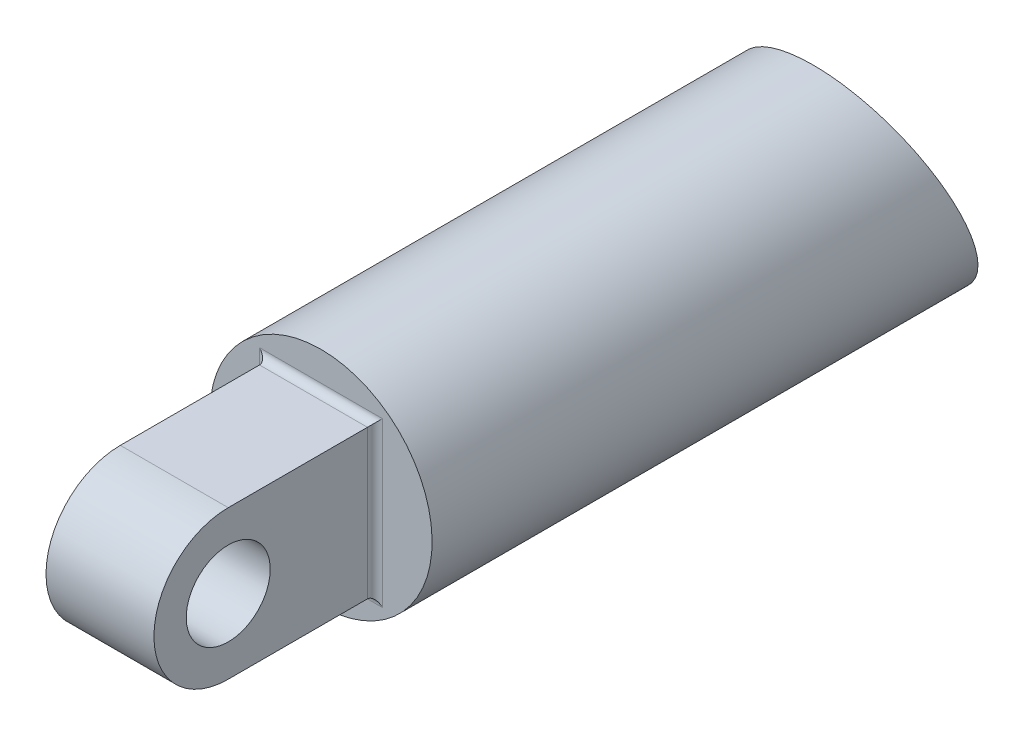
ISO-10303-21;
HEADER;
FILE_DESCRIPTION(('STEP AP214'),'2;1');
FILE_NAME('part.step','',(''),(''),'','','');
FILE_SCHEMA(('AUTOMOTIVE_DESIGN { 1 0 10303 214 1 1 1 1 }'));
ENDSEC;
DATA;
#1=APPLICATION_CONTEXT('core data for automotive mechanical design processes');
#2=APPLICATION_PROTOCOL_DEFINITION('international standard','automotive_design',2000,#1);
#3=PRODUCT_CONTEXT('',#1,'mechanical');
#4=PRODUCT('Part','Part','',(#3));
#5=PRODUCT_RELATED_PRODUCT_CATEGORY('part','',(#4));
#6=PRODUCT_DEFINITION_FORMATION('','',#4);
#7=PRODUCT_DEFINITION_CONTEXT('part definition',#1,'design');
#8=PRODUCT_DEFINITION('design','',#6,#7);
#9=PRODUCT_DEFINITION_SHAPE('','',#8);
#10=(LENGTH_UNIT() NAMED_UNIT(*) SI_UNIT(.MILLI.,.METRE.));
#11=(NAMED_UNIT(*) PLANE_ANGLE_UNIT() SI_UNIT($,.RADIAN.));
#12=(NAMED_UNIT(*) SI_UNIT($,.STERADIAN.) SOLID_ANGLE_UNIT());
#13=UNCERTAINTY_MEASURE_WITH_UNIT(LENGTH_MEASURE(1.E-05),#10,'distance_accuracy_value','');
#14=(GEOMETRIC_REPRESENTATION_CONTEXT(3) GLOBAL_UNCERTAINTY_ASSIGNED_CONTEXT((#13)) GLOBAL_UNIT_ASSIGNED_CONTEXT((#10,
#11,#12)) REPRESENTATION_CONTEXT('',''));
#15=CARTESIAN_POINT('',(0.,0.,0.));
#16=DIRECTION('',(0.,0.,1.));
#17=DIRECTION('',(1.,0.,0.));
#18=AXIS2_PLACEMENT_3D('',#15,#16,#17);
#19=CARTESIAN_POINT('',(-22.8599999999998,-3.60822483003176E-13,172.487053046245));
#20=DIRECTION('',(1.,0.,0.));
#21=DIRECTION('',(0.,1.,0.));
#22=AXIS2_PLACEMENT_3D('',#19,#20,#21);
#23=CYLINDRICAL_SURFACE('',#22,17.78);
#24=CARTESIAN_POINT('',(-22.8599999999997,-3.60822483003176E-13,172.487053046245));
#25=DIRECTION('',(1.,0.,0.));
#26=DIRECTION('',(0.,1.,0.));
#27=AXIS2_PLACEMENT_3D('',#24,#25,#26);
#28=CIRCLE('',#27,17.78);
#29=CARTESIAN_POINT('',(-22.8599999999997,17.7799999999996,172.487053046245));
#30=VERTEX_POINT('',#29);
#31=EDGE_CURVE('E108',#30,#30,#28,.F.);
#32=ORIENTED_EDGE('',*,*,#31,.T.);
#33=EDGE_LOOP('',(#32));
#34=FACE_BOUND('',#33,.T.);
#35=CARTESIAN_POINT('',(22.86,-3.29597460435593E-13,172.487053046245));
#36=DIRECTION('',(1.,0.,0.));
#37=DIRECTION('',(0.,1.,0.));
#38=AXIS2_PLACEMENT_3D('',#35,#36,#37);
#39=CIRCLE('',#38,17.78);
#40=CARTESIAN_POINT('',(22.86,17.7799999999997,172.487053046245));
#41=VERTEX_POINT('',#40);
#42=EDGE_CURVE('E74',#41,#41,#39,.F.);
#43=ORIENTED_EDGE('',*,*,#42,.F.);
#44=EDGE_LOOP('',(#43));
#45=FACE_BOUND('',#44,.T.);
#46=ADVANCED_FACE('F17',(#34,#45),#23,.F.);
#47=CARTESIAN_POINT('',(-22.8599999999998,-5.41433564649196E-13,172.487053046245));
#48=DIRECTION('',(1.,0.,0.));
#49=DIRECTION('',(0.,0.,-1.));
#50=AXIS2_PLACEMENT_3D('',#47,#48,#49);
#51=CYLINDRICAL_SURFACE('',#50,31.473842866138);
#52=CARTESIAN_POINT('',(-22.8599999999997,-5.41433564649196E-13,172.487053046245));
#53=DIRECTION('',(1.,0.,0.));
#54=DIRECTION('',(0.,0.,-1.));
#55=AXIS2_PLACEMENT_3D('',#52,#53,#54);
#56=CIRCLE('',#55,31.473842866138);
#57=CARTESIAN_POINT('',(-22.8599999999998,31.4738428661375,172.487053046245));
#58=VERTEX_POINT('',#57);
#59=CARTESIAN_POINT('',(-22.8599999999997,-31.4738428661386,172.487053046245));
#60=VERTEX_POINT('',#59);
#61=EDGE_CURVE('E112',#58,#60,#56,.T.);
#62=ORIENTED_EDGE('',*,*,#61,.T.);
#63=DIRECTION('',(1.,0.,0.));
#64=VECTOR('',#63,1.);
#65=CARTESIAN_POINT('',(-22.8599999999997,-31.4738428661386,172.487053046245));
#66=LINE('',#65,#64);
#67=CARTESIAN_POINT('',(22.86,-31.4738428661385,172.487053046245));
#68=VERTEX_POINT('',#67);
#69=EDGE_CURVE('E70',#68,#60,#66,.F.);
#70=ORIENTED_EDGE('',*,*,#69,.F.);
#71=CARTESIAN_POINT('',(22.8599999999999,-5.10977926637679E-13,172.487053046245));
#72=DIRECTION('',(1.,0.,0.));
#73=DIRECTION('',(0.,0.,-1.));
#74=AXIS2_PLACEMENT_3D('',#71,#72,#73);
#75=CIRCLE('',#74,31.473842866138);
#76=CARTESIAN_POINT('',(22.8599999999999,31.4738428661375,172.487053046245));
#77=VERTEX_POINT('',#76);
#78=EDGE_CURVE('E20',#77,#68,#75,.T.);
#79=ORIENTED_EDGE('',*,*,#78,.F.);
#80=DIRECTION('',(1.,0.,0.));
#81=VECTOR('',#80,1.);
#82=CARTESIAN_POINT('',(-22.8599999999997,31.4738428661375,172.487053046245));
#83=LINE('',#82,#81);
#84=EDGE_CURVE('E67',#58,#77,#83,.T.);
#85=ORIENTED_EDGE('',*,*,#84,.F.);
#86=EDGE_LOOP('',(#62,#70,#79,#85));
#87=FACE_BOUND('',#86,.T.);
#88=ADVANCED_FACE('F65',(#87),#51,.T.);
#89=CARTESIAN_POINT('',(22.8599999999999,-5.41433564649196E-13,151.55978917756));
#90=DIRECTION('',(1.,0.,0.));
#91=DIRECTION('',(0.,1.,0.));
#92=AXIS2_PLACEMENT_3D('',#89,#90,#91);
#93=PLANE('',#92);
#94=ORIENTED_EDGE('',*,*,#42,.T.);
#95=EDGE_LOOP('',(#94));
#96=FACE_BOUND('',#95,.T.);
#97=ORIENTED_EDGE('',*,*,#78,.T.);
#98=DIRECTION('',(0.,0.,1.));
#99=VECTOR('',#98,1.);
#100=CARTESIAN_POINT('',(22.8600000000001,-31.4738428661385,110.342111586706));
#101=LINE('',#100,#99);
#102=CARTESIAN_POINT('',(22.86,-31.4738428661385,113.517111586706));
#103=VERTEX_POINT('',#102);
#104=EDGE_CURVE('E111',#103,#68,#101,.T.);
#105=ORIENTED_EDGE('',*,*,#104,.F.);
#106=DIRECTION('',(0.,-1.,0.));
#107=VECTOR('',#106,1.);
#108=CARTESIAN_POINT('',(22.8599999999999,-5.43560634080617E-13,113.517111586706));
#109=LINE('',#108,#107);
#110=CARTESIAN_POINT('',(22.8599999999999,31.4738428661375,113.517111586706));
#111=VERTEX_POINT('',#110);
#112=EDGE_CURVE('E79',#111,#103,#109,.T.);
#113=ORIENTED_EDGE('',*,*,#112,.F.);
#114=DIRECTION('',(0.,0.,1.));
#115=VECTOR('',#114,1.);
#116=CARTESIAN_POINT('',(22.86,31.4738428661375,172.487053046245));
#117=LINE('',#116,#115);
#118=EDGE_CURVE('E76',#77,#111,#117,.F.);
#119=ORIENTED_EDGE('',*,*,#118,.F.);
#120=EDGE_LOOP('',(#97,#105,#113,#119));
#121=FACE_BOUND('',#120,.T.);
#122=ADVANCED_FACE('F77',(#96,#121),#93,.T.);
#123=CARTESIAN_POINT('',(-22.8599999999997,31.4738428661375,172.487053046245));
#124=DIRECTION('',(0.,1.,0.));
#125=DIRECTION('',(0.,0.,1.));
#126=AXIS2_PLACEMENT_3D('',#123,#124,#125);
#127=PLANE('',#126);
#128=ORIENTED_EDGE('',*,*,#84,.T.);
#129=ORIENTED_EDGE('',*,*,#118,.T.);
#130=DIRECTION('',(1.,0.,0.));
#131=VECTOR('',#130,1.);
#132=CARTESIAN_POINT('',(-11.4299999999998,31.4738428661375,113.517111586706));
#133=LINE('',#132,#131);
#134=CARTESIAN_POINT('',(-22.8599999999998,31.4738428661375,113.517111586706));
#135=VERTEX_POINT('',#134);
#136=EDGE_CURVE('E107',#135,#111,#133,.T.);
#137=ORIENTED_EDGE('',*,*,#136,.F.);
#138=DIRECTION('',(0.,0.,1.));
#139=VECTOR('',#138,1.);
#140=CARTESIAN_POINT('',(-22.8599999999998,31.4738428661375,151.55978917756));
#141=LINE('',#140,#139);
#142=EDGE_CURVE('E82',#135,#58,#141,.T.);
#143=ORIENTED_EDGE('',*,*,#142,.T.);
#144=EDGE_LOOP('',(#128,#129,#137,#143));
#145=FACE_BOUND('',#144,.T.);
#146=ADVANCED_FACE('F84',(#145),#127,.T.);
#147=CARTESIAN_POINT('',(-22.8599999999999,-5.41433564649196E-13,151.55978917756));
#148=DIRECTION('',(1.,0.,0.));
#149=DIRECTION('',(0.,1.,0.));
#150=AXIS2_PLACEMENT_3D('',#147,#148,#149);
#151=PLANE('',#150);
#152=ORIENTED_EDGE('',*,*,#31,.F.);
#153=EDGE_LOOP('',(#152));
#154=FACE_BOUND('',#153,.T.);
#155=DIRECTION('',(0.,0.,1.));
#156=VECTOR('',#155,1.);
#157=CARTESIAN_POINT('',(-22.8599999999997,-31.4738428661385,110.342111586706));
#158=LINE('',#157,#156);
#159=CARTESIAN_POINT('',(-22.8599999999998,-31.4738428661386,113.517111586706));
#160=VERTEX_POINT('',#159);
#161=EDGE_CURVE('E120',#60,#160,#158,.F.);
#162=ORIENTED_EDGE('',*,*,#161,.F.);
#163=ORIENTED_EDGE('',*,*,#61,.F.);
#164=ORIENTED_EDGE('',*,*,#142,.F.);
#165=DIRECTION('',(0.,1.,0.));
#166=VECTOR('',#165,1.);
#167=CARTESIAN_POINT('',(-22.8599999999999,-5.44946428182872E-13,113.517111586706));
#168=LINE('',#167,#166);
#169=EDGE_CURVE('E103',#160,#135,#168,.T.);
#170=ORIENTED_EDGE('',*,*,#169,.F.);
#171=EDGE_LOOP('',(#162,#163,#164,#170));
#172=FACE_BOUND('',#171,.T.);
#173=ADVANCED_FACE('F148',(#154,#172),#151,.F.);
#174=CARTESIAN_POINT('',(-22.8599999999997,-31.4738428661385,110.342111586706));
#175=DIRECTION('',(0.,-1.,0.));
#176=DIRECTION('',(1.,0.,0.));
#177=AXIS2_PLACEMENT_3D('',#174,#175,#176);
#178=PLANE('',#177);
#179=ORIENTED_EDGE('',*,*,#69,.T.);
#180=ORIENTED_EDGE('',*,*,#161,.T.);
#181=DIRECTION('',(-1.,0.,0.));
#182=VECTOR('',#181,1.);
#183=CARTESIAN_POINT('',(-11.4299999999998,-31.4738428661386,113.517111586706));
#184=LINE('',#183,#182);
#185=EDGE_CURVE('E100',#103,#160,#184,.T.);
#186=ORIENTED_EDGE('',*,*,#185,.F.);
#187=ORIENTED_EDGE('',*,*,#104,.T.);
#188=EDGE_LOOP('',(#179,#180,#186,#187));
#189=FACE_BOUND('',#188,.T.);
#190=ADVANCED_FACE('F151',(#189),#178,.T.);
#191=CARTESIAN_POINT('',(26.0349999999999,35.0646289805311,113.517111586706));
#192=DIRECTION('',(0.,-1.,0.));
#193=DIRECTION('',(1.,0.,0.));
#194=AXIS2_PLACEMENT_3D('',#191,#192,#193);
#195=CYLINDRICAL_SURFACE('',#194,3.175);
#196=CARTESIAN_POINT('',(26.0349999999999,-34.6488428661385,113.517111586706));
#197=DIRECTION('',(-0.707106781186547,-0.707106781186548,0.));
#198=DIRECTION('',(-0.707106781186548,0.707106781186547,0.));
#199=AXIS2_PLACEMENT_3D('',#196,#197,#198);
#200=ELLIPSE('',#199,4.49012806053458,3.175);
#201=CARTESIAN_POINT('',(26.0349999999999,-34.6488428661385,110.342111586706));
#202=VERTEX_POINT('',#201);
#203=EDGE_CURVE('E94',#202,#103,#200,.F.);
#204=ORIENTED_EDGE('',*,*,#203,.F.);
#205=DIRECTION('',(0.,1.,0.));
#206=VECTOR('',#205,1.);
#207=CARTESIAN_POINT('',(26.0349999999999,-5.41433564649196E-13,110.342111586706));
#208=LINE('',#207,#206);
#209=CARTESIAN_POINT('',(26.0349999999998,34.6488428661375,110.342111586706));
#210=VERTEX_POINT('',#209);
#211=EDGE_CURVE('E97',#202,#210,#208,.T.);
#212=ORIENTED_EDGE('',*,*,#211,.T.);
#213=CARTESIAN_POINT('',(26.0349999999999,34.6488428661375,113.517111586706));
#214=DIRECTION('',(0.707106781186548,-0.707106781186547,0.));
#215=DIRECTION('',(0.707106781186547,0.707106781186548,0.));
#216=AXIS2_PLACEMENT_3D('',#213,#214,#215);
#217=ELLIPSE('',#216,4.49012806053458,3.175);
#218=EDGE_CURVE('E104',#111,#210,#217,.T.);
#219=ORIENTED_EDGE('',*,*,#218,.F.);
#220=ORIENTED_EDGE('',*,*,#112,.T.);
#221=EDGE_LOOP('',(#204,#212,#219,#220));
#222=FACE_BOUND('',#221,.T.);
#223=ADVANCED_FACE('F142',(#222),#195,.F.);
#224=CARTESIAN_POINT('',(-26.3474199999998,34.6488428661374,113.517111586706));
#225=DIRECTION('',(1.,0.,0.));
#226=DIRECTION('',(0.,1.,0.));
#227=AXIS2_PLACEMENT_3D('',#224,#225,#226);
#228=CYLINDRICAL_SURFACE('',#227,3.175);
#229=ORIENTED_EDGE('',*,*,#218,.T.);
#230=DIRECTION('',(1.,0.,0.));
#231=VECTOR('',#230,1.);
#232=CARTESIAN_POINT('',(0.,34.6488428661375,110.342111586706));
#233=LINE('',#232,#231);
#234=CARTESIAN_POINT('',(-26.0349999999998,34.6488428661374,110.342111586706));
#235=VERTEX_POINT('',#234);
#236=EDGE_CURVE('E116',#210,#235,#233,.F.);
#237=ORIENTED_EDGE('',*,*,#236,.T.);
#238=CARTESIAN_POINT('',(-26.0349999999998,34.6488428661374,113.517111586706));
#239=DIRECTION('',(0.707106781186548,0.707106781186547,0.));
#240=DIRECTION('',(-0.707106781186547,0.707106781186548,0.));
#241=AXIS2_PLACEMENT_3D('',#238,#239,#240);
#242=ELLIPSE('',#241,4.49012806053457,3.175);
#243=EDGE_CURVE('E101',#135,#235,#242,.T.);
#244=ORIENTED_EDGE('',*,*,#243,.F.);
#245=ORIENTED_EDGE('',*,*,#136,.T.);
#246=EDGE_LOOP('',(#229,#237,#244,#245));
#247=FACE_BOUND('',#246,.T.);
#248=ADVANCED_FACE('F144',(#247),#228,.F.);
#249=CARTESIAN_POINT('',(-26.0349999999999,-35.0646289805322,113.517111586706));
#250=DIRECTION('',(0.,1.,0.));
#251=DIRECTION('',(0.,0.,1.));
#252=AXIS2_PLACEMENT_3D('',#249,#250,#251);
#253=CYLINDRICAL_SURFACE('',#252,3.175);
#254=ORIENTED_EDGE('',*,*,#243,.T.);
#255=DIRECTION('',(0.,1.,0.));
#256=VECTOR('',#255,1.);
#257=CARTESIAN_POINT('',(-26.0349999999998,-5.41433564649196E-13,110.342111586706));
#258=LINE('',#257,#256);
#259=CARTESIAN_POINT('',(-26.0349999999999,-34.6488428661385,110.342111586706));
#260=VERTEX_POINT('',#259);
#261=EDGE_CURVE('E35',#235,#260,#258,.F.);
#262=ORIENTED_EDGE('',*,*,#261,.T.);
#263=CARTESIAN_POINT('',(-26.0349999999999,-34.6488428661386,113.517111586706));
#264=DIRECTION('',(-0.707106781186547,0.707106781186548,0.));
#265=DIRECTION('',(-0.707106781186548,-0.707106781186547,0.));
#266=AXIS2_PLACEMENT_3D('',#263,#264,#265);
#267=ELLIPSE('',#266,4.49012806053458,3.175);
#268=EDGE_CURVE('E98',#160,#260,#267,.T.);
#269=ORIENTED_EDGE('',*,*,#268,.F.);
#270=ORIENTED_EDGE('',*,*,#169,.T.);
#271=EDGE_LOOP('',(#254,#262,#269,#270));
#272=FACE_BOUND('',#271,.T.);
#273=ADVANCED_FACE('F179',(#272),#253,.F.);
#274=CARTESIAN_POINT('',(26.3474199999999,-34.6488428661385,113.517111586706));
#275=DIRECTION('',(-1.,0.,0.));
#276=DIRECTION('',(0.,-1.,0.));
#277=AXIS2_PLACEMENT_3D('',#274,#275,#276);
#278=CYLINDRICAL_SURFACE('',#277,3.175);
#279=DIRECTION('',(1.,0.,0.));
#280=VECTOR('',#279,1.);
#281=CARTESIAN_POINT('',(0.,-34.6488428661386,110.342111586706));
#282=LINE('',#281,#280);
#283=EDGE_CURVE('E93',#260,#202,#282,.T.);
#284=ORIENTED_EDGE('',*,*,#283,.T.);
#285=ORIENTED_EDGE('',*,*,#203,.T.);
#286=ORIENTED_EDGE('',*,*,#185,.T.);
#287=ORIENTED_EDGE('',*,*,#268,.T.);
#288=EDGE_LOOP('',(#284,#285,#286,#287));
#289=FACE_BOUND('',#288,.T.);
#290=ADVANCED_FACE('F135',(#289),#278,.F.);
#291=CARTESIAN_POINT('',(0.,-5.41433564649196E-13,110.342111586706));
#292=DIRECTION('',(0.,0.,-1.));
#293=DIRECTION('',(0.,1.,0.));
#294=AXIS2_PLACEMENT_3D('',#291,#292,#293);
#295=PLANE('',#294);
#296=CARTESIAN_POINT('',(0.,-5.41433564649196E-13,110.342111586706));
#297=DIRECTION('',(0.,0.,-1.));
#298=DIRECTION('',(0.,1.,0.));
#299=AXIS2_PLACEMENT_3D('',#296,#297,#298);
#300=CIRCLE('',#299,47.0758077535598);
#301=CARTESIAN_POINT('',(0.,47.0758077535592,110.342111586706));
#302=VERTEX_POINT('',#301);
#303=EDGE_CURVE('E26',#302,#302,#300,.T.);
#304=ORIENTED_EDGE('',*,*,#303,.F.);
#305=EDGE_LOOP('',(#304));
#306=FACE_BOUND('',#305,.T.);
#307=ORIENTED_EDGE('',*,*,#261,.F.);
#308=ORIENTED_EDGE('',*,*,#236,.F.);
#309=ORIENTED_EDGE('',*,*,#211,.F.);
#310=ORIENTED_EDGE('',*,*,#283,.F.);
#311=EDGE_LOOP('',(#307,#308,#309,#310));
#312=FACE_BOUND('',#311,.T.);
#313=ADVANCED_FACE('F140',(#306,#312),#295,.F.);
#314=CARTESIAN_POINT('',(0.,52.4734857765071,-96.0124990338463));
#315=DIRECTION('',(0.,-0.374606593415912,0.927183854566788));
#316=DIRECTION('',(0.,-0.927183854566788,-0.374606593415912));
#317=AXIS2_PLACEMENT_3D('',#314,#315,#316);
#318=PLANE('',#317);
#319=CARTESIAN_POINT('',(0.,-1.5779317374777E-13,-117.213163448543));
#320=DIRECTION('',(0.,-0.374606593415912,0.927183854566788));
#321=DIRECTION('',(0.,-0.927183854566788,-0.374606593415912));
#322=AXIS2_PLACEMENT_3D('',#319,#320,#321);
#323=ELLIPSE('',#322,50.7728942018249,47.0758077535598);
#324=CARTESIAN_POINT('',(0.,-47.0758077535599,-136.233024383355));
#325=VERTEX_POINT('',#324);
#326=EDGE_CURVE('E11',#325,#325,#323,.T.);
#327=ORIENTED_EDGE('',*,*,#326,.F.);
#328=EDGE_LOOP('',(#327));
#329=FACE_BOUND('',#328,.T.);
#330=ADVANCED_FACE('F164',(#329),#318,.F.);
#331=CARTESIAN_POINT('',(0.,-5.41433564649196E-13,110.342111586706));
#332=DIRECTION('',(0.,0.,-1.));
#333=DIRECTION('',(0.,1.,0.));
#334=AXIS2_PLACEMENT_3D('',#331,#332,#333);
#335=CYLINDRICAL_SURFACE('',#334,47.0758077535598);
#336=ORIENTED_EDGE('',*,*,#303,.T.);
#337=EDGE_LOOP('',(#336));
#338=FACE_BOUND('',#337,.T.);
#339=ORIENTED_EDGE('',*,*,#326,.T.);
#340=EDGE_LOOP('',(#339));
#341=FACE_BOUND('',#340,.T.);
#342=ADVANCED_FACE('F162',(#338,#341),#335,.T.);
#343=CLOSED_SHELL('',(#46,#88,#122,#146,#173,#190,#223,#248,#273,#290,#313,#330,#342));
#344=MANIFOLD_SOLID_BREP('B1',#343);
#345=ADVANCED_BREP_SHAPE_REPRESENTATION('',(#18,#344),#14);
#346=SHAPE_DEFINITION_REPRESENTATION(#9,#345);
ENDSEC;
END-ISO-10303-21;
